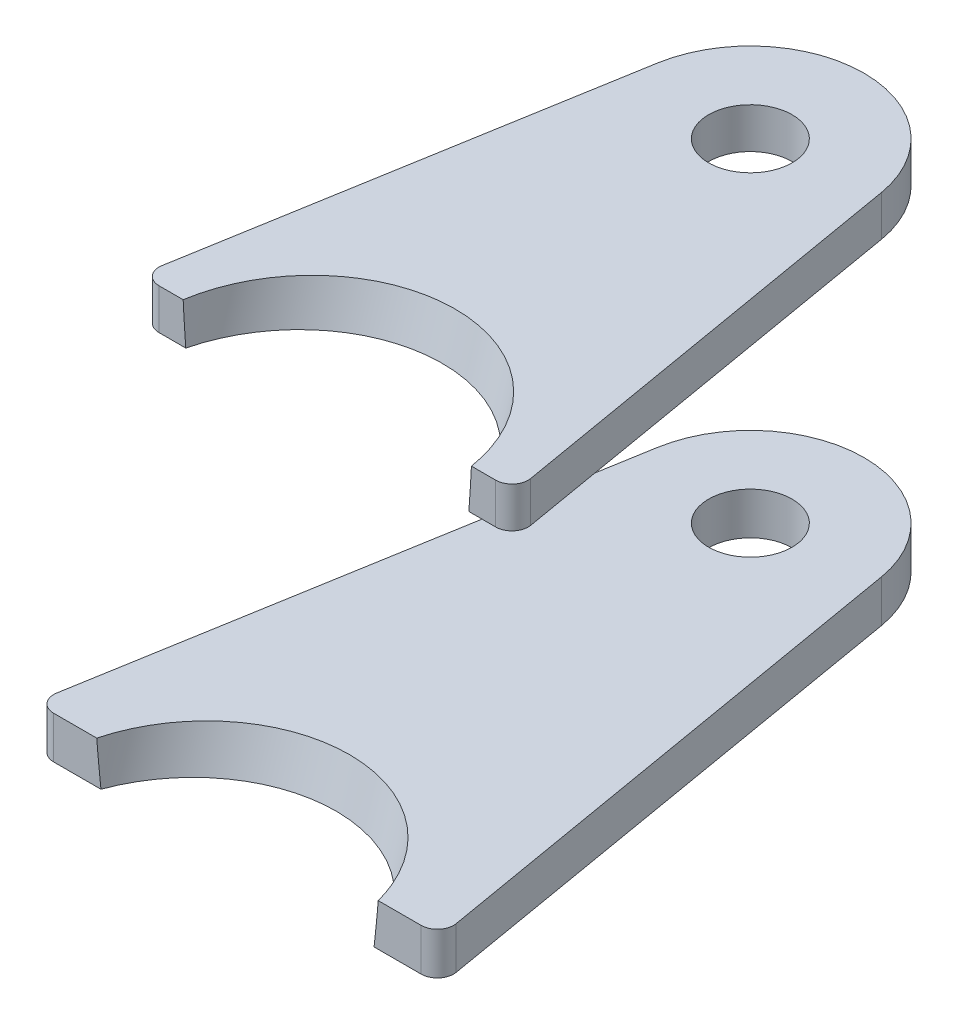
ISO-10303-21;
HEADER;
FILE_DESCRIPTION(('STEP AP214'),'2;1');
FILE_NAME('part.step','',(''),(''),'','','');
FILE_SCHEMA(('AUTOMOTIVE_DESIGN { 1 0 10303 214 1 1 1 1 }'));
ENDSEC;
DATA;
#1=APPLICATION_CONTEXT('core data for automotive mechanical design processes');
#2=APPLICATION_PROTOCOL_DEFINITION('international standard','automotive_design',2000,#1);
#3=PRODUCT_CONTEXT('',#1,'mechanical');
#4=PRODUCT('Part','Part','',(#3));
#5=PRODUCT_RELATED_PRODUCT_CATEGORY('part','',(#4));
#6=PRODUCT_DEFINITION_FORMATION('','',#4);
#7=PRODUCT_DEFINITION_CONTEXT('part definition',#1,'design');
#8=PRODUCT_DEFINITION('design','',#6,#7);
#9=PRODUCT_DEFINITION_SHAPE('','',#8);
#10=(LENGTH_UNIT() NAMED_UNIT(*) SI_UNIT(.MILLI.,.METRE.));
#11=(NAMED_UNIT(*) PLANE_ANGLE_UNIT() SI_UNIT($,.RADIAN.));
#12=(NAMED_UNIT(*) SI_UNIT($,.STERADIAN.) SOLID_ANGLE_UNIT());
#13=UNCERTAINTY_MEASURE_WITH_UNIT(LENGTH_MEASURE(1.E-05),#10,'distance_accuracy_value','');
#14=(GEOMETRIC_REPRESENTATION_CONTEXT(3) GLOBAL_UNCERTAINTY_ASSIGNED_CONTEXT((#13)) GLOBAL_UNIT_ASSIGNED_CONTEXT((#10,
#11,#12)) REPRESENTATION_CONTEXT('',''));
#15=CARTESIAN_POINT('',(0.,0.,0.));
#16=DIRECTION('',(0.,0.,1.));
#17=DIRECTION('',(1.,0.,0.));
#18=AXIS2_PLACEMENT_3D('',#15,#16,#17);
#19=CARTESIAN_POINT('',(0.,-11.43,0.));
#20=DIRECTION('',(0.,1.,0.));
#21=DIRECTION('',(0.,0.,-1.));
#22=AXIS2_PLACEMENT_3D('',#19,#20,#21);
#23=PLANE('',#22);
#24=DIRECTION('',(-1.,0.,0.));
#25=VECTOR('',#24,1.);
#26=CARTESIAN_POINT('',(0.,-11.43,40.1184711091296));
#27=LINE('',#26,#25);
#28=CARTESIAN_POINT('',(-11.0027053740969,-11.43,40.1184711091296));
#29=VERTEX_POINT('',#28);
#30=CARTESIAN_POINT('',(-14.3695490254812,-11.43,40.1184711091296));
#31=VERTEX_POINT('',#30);
#32=EDGE_CURVE('E127',#29,#31,#27,.T.);
#33=ORIENTED_EDGE('',*,*,#32,.F.);
#34=CARTESIAN_POINT('',(0.00635000098012531,-11.43,43.3453711793951));
#35=DIRECTION('',(0.,-1.,0.));
#36=DIRECTION('',(0.00174746557868569,0.,0.99999847318086));
#37=AXIS2_PLACEMENT_3D('',#34,#35,#36);
#38=ELLIPSE('',#37,11.993733960152,11.43);
#39=CARTESIAN_POINT('',(11.0143701263817,-11.43,40.1184711091295));
#40=VERTEX_POINT('',#39);
#41=EDGE_CURVE('E134',#40,#29,#38,.F.);
#42=ORIENTED_EDGE('',*,*,#41,.F.);
#43=CARTESIAN_POINT('',(14.3695490254812,-11.43,40.1184711091295));
#44=VERTEX_POINT('',#43);
#45=EDGE_CURVE('E139',#44,#40,#27,.T.);
#46=ORIENTED_EDGE('',*,*,#45,.F.);
#47=CARTESIAN_POINT('',(14.3695490254812,-11.43,38.8484711091295));
#48=DIRECTION('',(0.,-1.,0.));
#49=DIRECTION('',(0.,0.,-1.));
#50=AXIS2_PLACEMENT_3D('',#47,#48,#49);
#51=CIRCLE('',#50,1.27);
#52=CARTESIAN_POINT('',(15.6214000011449,-11.43,38.6345338876608));
#53=VERTEX_POINT('',#52);
#54=EDGE_CURVE('E185',#53,#44,#51,.T.);
#55=ORIENTED_EDGE('',*,*,#54,.F.);
#56=DIRECTION('',(0.168454505093508,0.,0.985709429656479));
#57=VECTOR('',#56,1.);
#58=CARTESIAN_POINT('',(8.76295682964609,-11.43,-1.49756055028128));
#59=LINE('',#58,#57);
#60=CARTESIAN_POINT('',(8.76295682964609,-11.43,-1.49756055028128));
#61=VERTEX_POINT('',#60);
#62=EDGE_CURVE('E149',#61,#53,#59,.T.);
#63=ORIENTED_EDGE('',*,*,#62,.F.);
#64=CARTESIAN_POINT('',(0.,-11.43,0.));
#65=DIRECTION('',(0.,-1.,0.));
#66=DIRECTION('',(0.,0.,-1.));
#67=AXIS2_PLACEMENT_3D('',#64,#65,#66);
#68=CIRCLE('',#67,8.89);
#69=CARTESIAN_POINT('',(-8.76295682964609,-11.43,-1.49756055028128));
#70=VERTEX_POINT('',#69);
#71=EDGE_CURVE('E146',#70,#61,#68,.T.);
#72=ORIENTED_EDGE('',*,*,#71,.F.);
#73=DIRECTION('',(-0.168454505093508,0.,0.985709429656479));
#74=VECTOR('',#73,1.);
#75=CARTESIAN_POINT('',(-8.76295682964609,-11.43,-1.49756055028128));
#76=LINE('',#75,#74);
#77=CARTESIAN_POINT('',(-15.6214000011449,-11.43,38.6345338876608));
#78=VERTEX_POINT('',#77);
#79=EDGE_CURVE('E169',#70,#78,#76,.T.);
#80=ORIENTED_EDGE('',*,*,#79,.T.);
#81=CARTESIAN_POINT('',(-14.3695490254812,-11.43,38.8484711091296));
#82=DIRECTION('',(0.,-1.,0.));
#83=DIRECTION('',(0.,0.,-1.));
#84=AXIS2_PLACEMENT_3D('',#81,#82,#83);
#85=CIRCLE('',#84,1.27);
#86=EDGE_CURVE('E145',#31,#78,#85,.T.);
#87=ORIENTED_EDGE('',*,*,#86,.F.);
#88=EDGE_LOOP('',(#33,#42,#46,#55,#63,#72,#80,#87));
#89=FACE_BOUND('',#88,.T.);
#90=CARTESIAN_POINT('',(0.,-11.43,0.));
#91=DIRECTION('',(0.,-1.,0.));
#92=DIRECTION('',(0.,0.,-1.));
#93=AXIS2_PLACEMENT_3D('',#90,#91,#92);
#94=CIRCLE('',#93,3.2639);
#95=CARTESIAN_POINT('',(0.,-11.43,-3.2639));
#96=VERTEX_POINT('',#95);
#97=EDGE_CURVE('E163',#96,#96,#94,.T.);
#98=ORIENTED_EDGE('',*,*,#97,.T.);
#99=EDGE_LOOP('',(#98));
#100=FACE_BOUND('',#99,.T.);
#101=ADVANCED_FACE('F56',(#89,#100),#23,.T.);
#102=CARTESIAN_POINT('',(-14.3695490254812,-14.732,38.8484711091296));
#103=DIRECTION('',(0.,-1.,0.));
#104=DIRECTION('',(0.,0.,1.));
#105=AXIS2_PLACEMENT_3D('',#102,#103,#104);
#106=CYLINDRICAL_SURFACE('',#105,1.27);
#107=CARTESIAN_POINT('',(-14.3695490254812,-14.732,38.8484711091296));
#108=DIRECTION('',(0.,-1.,0.));
#109=DIRECTION('',(0.,0.,-1.));
#110=AXIS2_PLACEMENT_3D('',#107,#108,#109);
#111=CIRCLE('',#110,1.27);
#112=CARTESIAN_POINT('',(-15.6214000011449,-14.732,38.6345338876608));
#113=VERTEX_POINT('',#112);
#114=CARTESIAN_POINT('',(-14.3695490254812,-14.732,40.1184711091296));
#115=VERTEX_POINT('',#114);
#116=EDGE_CURVE('E183',#113,#115,#111,.F.);
#117=ORIENTED_EDGE('',*,*,#116,.T.);
#118=DIRECTION('',(0.,1.,0.));
#119=VECTOR('',#118,1.);
#120=CARTESIAN_POINT('',(-14.3695490254812,-11.43,40.1184711091296));
#121=LINE('',#120,#119);
#122=EDGE_CURVE('E176',#115,#31,#121,.T.);
#123=ORIENTED_EDGE('',*,*,#122,.T.);
#124=ORIENTED_EDGE('',*,*,#86,.T.);
#125=DIRECTION('',(0.,1.,0.));
#126=VECTOR('',#125,1.);
#127=CARTESIAN_POINT('',(-15.6214000011449,-14.732,38.6345338876608));
#128=LINE('',#127,#126);
#129=EDGE_CURVE('E188',#78,#113,#128,.F.);
#130=ORIENTED_EDGE('',*,*,#129,.T.);
#131=EDGE_LOOP('',(#117,#123,#124,#130));
#132=FACE_BOUND('',#131,.T.);
#133=ADVANCED_FACE('F187',(#132),#106,.T.);
#134=CARTESIAN_POINT('',(-8.76295682964609,-14.732,-1.49756055028128));
#135=DIRECTION('',(0.985709429656479,0.,0.168454505093508));
#136=DIRECTION('',(-0.168454505093508,0.,0.985709429656479));
#137=AXIS2_PLACEMENT_3D('',#134,#135,#136);
#138=PLANE('',#137);
#139=ORIENTED_EDGE('',*,*,#79,.F.);
#140=DIRECTION('',(0.,1.,0.));
#141=VECTOR('',#140,1.);
#142=CARTESIAN_POINT('',(-8.76295682964609,-14.732,-1.49756055028128));
#143=LINE('',#142,#141);
#144=CARTESIAN_POINT('',(-8.76295682964609,-14.732,-1.49756055028128));
#145=VERTEX_POINT('',#144);
#146=EDGE_CURVE('E130',#145,#70,#143,.T.);
#147=ORIENTED_EDGE('',*,*,#146,.F.);
#148=DIRECTION('',(-0.168454505093508,0.,0.985709429656479));
#149=VECTOR('',#148,1.);
#150=CARTESIAN_POINT('',(-8.76295682964609,-14.732,-1.49756055028128));
#151=LINE('',#150,#149);
#152=EDGE_CURVE('E155',#145,#113,#151,.T.);
#153=ORIENTED_EDGE('',*,*,#152,.T.);
#154=ORIENTED_EDGE('',*,*,#129,.F.);
#155=EDGE_LOOP('',(#139,#147,#153,#154));
#156=FACE_BOUND('',#155,.T.);
#157=ADVANCED_FACE('F207',(#156),#138,.F.);
#158=CARTESIAN_POINT('',(0.,-14.732,0.));
#159=DIRECTION('',(0.,1.,0.));
#160=DIRECTION('',(0.,0.,-1.));
#161=AXIS2_PLACEMENT_3D('',#158,#159,#160);
#162=CYLINDRICAL_SURFACE('',#161,8.89);
#163=ORIENTED_EDGE('',*,*,#146,.T.);
#164=ORIENTED_EDGE('',*,*,#71,.T.);
#165=DIRECTION('',(0.,1.,0.));
#166=VECTOR('',#165,1.);
#167=CARTESIAN_POINT('',(8.76295682964609,-14.732,-1.49756055028128));
#168=LINE('',#167,#166);
#169=CARTESIAN_POINT('',(8.76295682964609,-14.732,-1.49756055028128));
#170=VERTEX_POINT('',#169);
#171=EDGE_CURVE('E165',#170,#61,#168,.T.);
#172=ORIENTED_EDGE('',*,*,#171,.F.);
#173=CARTESIAN_POINT('',(0.,-14.732,0.));
#174=DIRECTION('',(0.,-1.,0.));
#175=DIRECTION('',(0.,0.,-1.));
#176=AXIS2_PLACEMENT_3D('',#173,#174,#175);
#177=CIRCLE('',#176,8.89);
#178=EDGE_CURVE('E167',#145,#170,#177,.T.);
#179=ORIENTED_EDGE('',*,*,#178,.F.);
#180=EDGE_LOOP('',(#163,#164,#172,#179));
#181=FACE_BOUND('',#180,.T.);
#182=ADVANCED_FACE('F203',(#181),#162,.T.);
#183=CARTESIAN_POINT('',(8.76295682964609,-14.732,-1.49756055028128));
#184=DIRECTION('',(0.985709429656479,0.,-0.168454505093508));
#185=DIRECTION('',(0.168454505093508,0.,0.985709429656479));
#186=AXIS2_PLACEMENT_3D('',#183,#184,#185);
#187=PLANE('',#186);
#188=DIRECTION('',(0.168454505093508,0.,0.985709429656479));
#189=VECTOR('',#188,1.);
#190=CARTESIAN_POINT('',(8.76295682964609,-14.732,-1.49756055028128));
#191=LINE('',#190,#189);
#192=CARTESIAN_POINT('',(15.6214000011449,-14.732,38.6345338876608));
#193=VERTEX_POINT('',#192);
#194=EDGE_CURVE('E159',#170,#193,#191,.T.);
#195=ORIENTED_EDGE('',*,*,#194,.F.);
#196=ORIENTED_EDGE('',*,*,#171,.T.);
#197=ORIENTED_EDGE('',*,*,#62,.T.);
#198=DIRECTION('',(0.,1.,0.));
#199=VECTOR('',#198,1.);
#200=CARTESIAN_POINT('',(15.6214000011449,-14.732,38.6345338876608));
#201=LINE('',#200,#199);
#202=EDGE_CURVE('E64',#193,#53,#201,.T.);
#203=ORIENTED_EDGE('',*,*,#202,.F.);
#204=EDGE_LOOP('',(#195,#196,#197,#203));
#205=FACE_BOUND('',#204,.T.);
#206=ADVANCED_FACE('F199',(#205),#187,.T.);
#207=CARTESIAN_POINT('',(14.3695490254812,-14.732,38.8484711091295));
#208=DIRECTION('',(0.,1.,0.));
#209=DIRECTION('',(0.,0.,-1.));
#210=AXIS2_PLACEMENT_3D('',#207,#208,#209);
#211=CYLINDRICAL_SURFACE('',#210,1.27);
#212=CARTESIAN_POINT('',(14.3695490254812,-14.732,38.8484711091295));
#213=DIRECTION('',(0.,-1.,0.));
#214=DIRECTION('',(0.,0.,-1.));
#215=AXIS2_PLACEMENT_3D('',#212,#213,#214);
#216=CIRCLE('',#215,1.27);
#217=CARTESIAN_POINT('',(14.3695490254812,-14.732,40.1184711091295));
#218=VERTEX_POINT('',#217);
#219=EDGE_CURVE('E70',#218,#193,#216,.F.);
#220=ORIENTED_EDGE('',*,*,#219,.T.);
#221=ORIENTED_EDGE('',*,*,#202,.T.);
#222=ORIENTED_EDGE('',*,*,#54,.T.);
#223=DIRECTION('',(0.,1.,0.));
#224=VECTOR('',#223,1.);
#225=CARTESIAN_POINT('',(14.3695490254812,-14.732,40.1184711091295));
#226=LINE('',#225,#224);
#227=EDGE_CURVE('E12',#44,#218,#226,.F.);
#228=ORIENTED_EDGE('',*,*,#227,.T.);
#229=EDGE_LOOP('',(#220,#221,#222,#228));
#230=FACE_BOUND('',#229,.T.);
#231=ADVANCED_FACE('F58',(#230),#211,.T.);
#232=CARTESIAN_POINT('',(0.,-14.732,40.1184711091296));
#233=DIRECTION('',(0.,0.,1.));
#234=DIRECTION('',(-1.,0.,0.));
#235=AXIS2_PLACEMENT_3D('',#232,#233,#234);
#236=PLANE('',#235);
#237=ORIENTED_EDGE('',*,*,#45,.T.);
#238=CARTESIAN_POINT('',(0.000711095571889094,-1.27997183153469,40.1184711091296));
#239=DIRECTION('',(0.,0.,-1.));
#240=DIRECTION('',(0.00055555555555526,-0.999999845679001,0.));
#241=AXIS2_PLACEMENT_3D('',#238,#239,#240);
#242=ELLIPSE('',#241,37.7255988378355,11.43);
#243=CARTESIAN_POINT('',(10.686165471172,-14.732,40.1184711091295));
#244=VERTEX_POINT('',#243);
#245=EDGE_CURVE('E132',#244,#40,#242,.F.);
#246=ORIENTED_EDGE('',*,*,#245,.F.);
#247=DIRECTION('',(-1.,0.,0.));
#248=VECTOR('',#247,1.);
#249=CARTESIAN_POINT('',(0.,-14.732,40.1184711091296));
#250=LINE('',#249,#248);
#251=EDGE_CURVE('E78',#218,#244,#250,.T.);
#252=ORIENTED_EDGE('',*,*,#251,.F.);
#253=ORIENTED_EDGE('',*,*,#227,.F.);
#254=EDGE_LOOP('',(#237,#246,#252,#253));
#255=FACE_BOUND('',#254,.T.);
#256=ADVANCED_FACE('F226',(#255),#236,.T.);
#257=CARTESIAN_POINT('',(-10.6711686161259,-14.732,40.1184711091296));
#258=VERTEX_POINT('',#257);
#259=EDGE_CURVE('E128',#258,#115,#250,.T.);
#260=ORIENTED_EDGE('',*,*,#259,.F.);
#261=EDGE_CURVE('E122',#29,#258,#242,.F.);
#262=ORIENTED_EDGE('',*,*,#261,.F.);
#263=ORIENTED_EDGE('',*,*,#32,.T.);
#264=ORIENTED_EDGE('',*,*,#122,.F.);
#265=EDGE_LOOP('',(#260,#262,#263,#264));
#266=FACE_BOUND('',#265,.T.);
#267=ADVANCED_FACE('F124',(#266),#236,.T.);
#268=CARTESIAN_POINT('',(0.,-14.732,0.));
#269=DIRECTION('',(0.,1.,0.));
#270=DIRECTION('',(0.,0.,-1.));
#271=AXIS2_PLACEMENT_3D('',#268,#269,#270);
#272=PLANE('',#271);
#273=ORIENTED_EDGE('',*,*,#152,.F.);
#274=ORIENTED_EDGE('',*,*,#178,.T.);
#275=ORIENTED_EDGE('',*,*,#194,.T.);
#276=ORIENTED_EDGE('',*,*,#219,.F.);
#277=ORIENTED_EDGE('',*,*,#251,.T.);
#278=CARTESIAN_POINT('',(0.00818444570766258,-14.732,44.3951440327475));
#279=DIRECTION('',(0.,-1.,0.));
#280=DIRECTION('',(0.00174746557868569,0.,0.99999847318086));
#281=AXIS2_PLACEMENT_3D('',#278,#279,#280);
#282=ELLIPSE('',#281,11.993733960152,11.43);
#283=EDGE_CURVE('E175',#244,#258,#282,.F.);
#284=ORIENTED_EDGE('',*,*,#283,.T.);
#285=ORIENTED_EDGE('',*,*,#259,.T.);
#286=ORIENTED_EDGE('',*,*,#116,.F.);
#287=EDGE_LOOP('',(#273,#274,#275,#276,#277,#284,#285,#286));
#288=FACE_BOUND('',#287,.T.);
#289=CARTESIAN_POINT('',(0.,-14.732,0.));
#290=DIRECTION('',(0.,-1.,0.));
#291=DIRECTION('',(0.,0.,-1.));
#292=AXIS2_PLACEMENT_3D('',#289,#290,#291);
#293=CIRCLE('',#292,3.2639);
#294=CARTESIAN_POINT('',(0.,-14.732,-3.2639));
#295=VERTEX_POINT('',#294);
#296=EDGE_CURVE('E153',#295,#295,#293,.T.);
#297=ORIENTED_EDGE('',*,*,#296,.F.);
#298=EDGE_LOOP('',(#297));
#299=FACE_BOUND('',#298,.T.);
#300=ADVANCED_FACE('F180',(#288,#299),#272,.F.);
#301=CARTESIAN_POINT('',(0.,-14.732,0.));
#302=DIRECTION('',(0.,1.,0.));
#303=DIRECTION('',(0.,0.,-1.));
#304=AXIS2_PLACEMENT_3D('',#301,#302,#303);
#305=CYLINDRICAL_SURFACE('',#304,3.2639);
#306=CARTESIAN_POINT('',(0.,-14.732,-3.2639));
#307=CARTESIAN_POINT('',(0.,-14.6976041666667,-3.2639));
#308=CARTESIAN_POINT('',(0.,-14.6632083333333,-3.2639));
#309=CARTESIAN_POINT('',(0.,-14.5944166666667,-3.2639));
#310=CARTESIAN_POINT('',(0.,-14.5600208333333,-3.2639));
#311=CARTESIAN_POINT('',(0.,-14.4912291666667,-3.2639));
#312=CARTESIAN_POINT('',(0.,-14.4568333333333,-3.2639));
#313=CARTESIAN_POINT('',(0.,-14.3880416666667,-3.2639));
#314=CARTESIAN_POINT('',(0.,-14.3536458333333,-3.2639));
#315=CARTESIAN_POINT('',(0.,-14.2848541666667,-3.2639));
#316=CARTESIAN_POINT('',(0.,-14.2504583333333,-3.2639));
#317=CARTESIAN_POINT('',(0.,-14.1816666666667,-3.2639));
#318=CARTESIAN_POINT('',(0.,-14.1472708333333,-3.2639));
#319=CARTESIAN_POINT('',(0.,-14.0784791666667,-3.2639));
#320=CARTESIAN_POINT('',(0.,-14.0440833333333,-3.2639));
#321=CARTESIAN_POINT('',(0.,-13.9752916666667,-3.2639));
#322=CARTESIAN_POINT('',(0.,-13.9408958333333,-3.2639));
#323=CARTESIAN_POINT('',(0.,-13.8721041666667,-3.2639));
#324=CARTESIAN_POINT('',(0.,-13.8377083333333,-3.2639));
#325=CARTESIAN_POINT('',(0.,-13.7689166666667,-3.2639));
#326=CARTESIAN_POINT('',(0.,-13.7345208333333,-3.2639));
#327=CARTESIAN_POINT('',(0.,-13.6657291666667,-3.2639));
#328=CARTESIAN_POINT('',(0.,-13.6313333333333,-3.2639));
#329=CARTESIAN_POINT('',(0.,-13.5625416666667,-3.2639));
#330=CARTESIAN_POINT('',(0.,-13.5281458333333,-3.2639));
#331=CARTESIAN_POINT('',(0.,-13.4593541666667,-3.2639));
#332=CARTESIAN_POINT('',(0.,-13.4249583333333,-3.2639));
#333=CARTESIAN_POINT('',(0.,-13.3561666666667,-3.2639));
#334=CARTESIAN_POINT('',(0.,-13.3217708333333,-3.2639));
#335=CARTESIAN_POINT('',(0.,-13.2529791666667,-3.2639));
#336=CARTESIAN_POINT('',(0.,-13.2185833333333,-3.2639));
#337=CARTESIAN_POINT('',(0.,-13.1497916666667,-3.2639));
#338=CARTESIAN_POINT('',(0.,-13.1153958333333,-3.2639));
#339=CARTESIAN_POINT('',(0.,-13.0466041666667,-3.2639));
#340=CARTESIAN_POINT('',(0.,-13.0122083333333,-3.2639));
#341=CARTESIAN_POINT('',(0.,-12.9434166666667,-3.2639));
#342=CARTESIAN_POINT('',(0.,-12.9090208333333,-3.2639));
#343=CARTESIAN_POINT('',(0.,-12.8402291666667,-3.2639));
#344=CARTESIAN_POINT('',(0.,-12.8058333333333,-3.2639));
#345=CARTESIAN_POINT('',(0.,-12.7370416666667,-3.2639));
#346=CARTESIAN_POINT('',(0.,-12.7026458333333,-3.2639));
#347=CARTESIAN_POINT('',(0.,-12.6338541666667,-3.2639));
#348=CARTESIAN_POINT('',(0.,-12.5994583333333,-3.2639));
#349=CARTESIAN_POINT('',(0.,-12.5306666666667,-3.2639));
#350=CARTESIAN_POINT('',(0.,-12.4962708333333,-3.2639));
#351=CARTESIAN_POINT('',(0.,-12.4274791666667,-3.2639));
#352=CARTESIAN_POINT('',(0.,-12.3930833333333,-3.2639));
#353=CARTESIAN_POINT('',(0.,-12.3242916666667,-3.2639));
#354=CARTESIAN_POINT('',(0.,-12.2898958333333,-3.2639));
#355=CARTESIAN_POINT('',(0.,-12.2211041666667,-3.2639));
#356=CARTESIAN_POINT('',(0.,-12.1867083333333,-3.2639));
#357=CARTESIAN_POINT('',(0.,-12.1179166666667,-3.2639));
#358=CARTESIAN_POINT('',(0.,-12.0835208333333,-3.2639));
#359=CARTESIAN_POINT('',(0.,-12.0147291666667,-3.2639));
#360=CARTESIAN_POINT('',(0.,-11.9803333333333,-3.2639));
#361=CARTESIAN_POINT('',(0.,-11.9115416666667,-3.2639));
#362=CARTESIAN_POINT('',(0.,-11.8771458333333,-3.2639));
#363=CARTESIAN_POINT('',(0.,-11.8083541666667,-3.2639));
#364=CARTESIAN_POINT('',(0.,-11.7739583333333,-3.2639));
#365=CARTESIAN_POINT('',(0.,-11.7051666666667,-3.2639));
#366=CARTESIAN_POINT('',(0.,-11.6707708333333,-3.2639));
#367=CARTESIAN_POINT('',(0.,-11.6019791666667,-3.2639));
#368=CARTESIAN_POINT('',(0.,-11.5675833333333,-3.2639));
#369=CARTESIAN_POINT('',(0.,-11.4987916666667,-3.2639));
#370=CARTESIAN_POINT('',(0.,-11.4643958333333,-3.2639));
#371=CARTESIAN_POINT('',(0.,-11.43,-3.2639));
#372=B_SPLINE_CURVE_WITH_KNOTS('',3,(#306,#307,#308,#309,#310,#311,#312,#313,#314,#315,#316,
#317,#318,#319,#320,#321,#322,#323,#324,#325,#326,#327,#328,#329,#330,#331,#332,#333,#334,#335,
#336,#337,#338,#339,#340,#341,#342,#343,#344,#345,#346,#347,#348,#349,#350,#351,#352,#353,#354,
#355,#356,#357,#358,#359,#360,#361,#362,#363,#364,#365,#366,#367,#368,#369,#370,#371),
.UNSPECIFIED.,.F.,.F.,(4,2,2,2,2,2,2,2,2,2,2,2,2,2,2,2,2,2,2,2,2,2,2,2,2,2,2,2,2,2,2,2,4),(0.,
0.103187499999999,0.206375,0.309562499999999,0.41275,0.515937499999999,0.619125,
0.722312499999999,0.8255,0.928687499999999,1.031875,1.1350625,1.23825,1.3414375,1.444625,
1.5478125,1.651,1.7541875,1.857375,1.9605625,2.06375,2.1669375,2.270125,2.3733125,2.4765,
2.5796875,2.682875,2.7860625,2.88925,2.9924375,3.095625,3.1988125,3.302),.UNSPECIFIED.);
#373=EDGE_CURVE('BSEAM224',#295,#96,#372,.T.);
#374=ORIENTED_EDGE('',*,*,#296,.T.);
#375=ORIENTED_EDGE('',*,*,#97,.F.);
#376=ORIENTED_EDGE('',*,*,#373,.T.);
#377=ORIENTED_EDGE('',*,*,#373,.F.);
#378=EDGE_LOOP('',(#374,#376,#375,#377));
#379=FACE_BOUND('',#378,.T.);
#380=ADVANCED_FACE('F224',(#379),#305,.F.);
#381=CARTESIAN_POINT('',(-0.0609017951073154,109.623214276372,4.86009614657135));
#382=DIRECTION('',(0.000529443207681107,-0.952997626758693,0.302977297965028));
#383=DIRECTION('',(-0.000168320721091388,0.302977251209269,0.952997773826262));
#384=AXIS2_PLACEMENT_3D('',#381,#382,#383);
#385=CYLINDRICAL_SURFACE('',#384,11.43);
#386=ORIENTED_EDGE('',*,*,#283,.F.);
#387=ORIENTED_EDGE('',*,*,#245,.T.);
#388=ORIENTED_EDGE('',*,*,#41,.T.);
#389=ORIENTED_EDGE('',*,*,#261,.T.);
#390=EDGE_LOOP('',(#386,#387,#388,#389));
#391=FACE_BOUND('',#390,.T.);
#392=ADVANCED_FACE('F135',(#391),#385,.F.);
#393=CLOSED_SHELL('',(#101,#133,#157,#182,#206,#231,#256,#267,#300,#380,#392));
#394=MANIFOLD_SOLID_BREP('B2',#393);
#395=CARTESIAN_POINT('',(-8.76295682964609,14.605,-1.49756055028128));
#396=DIRECTION('',(-0.985709429656479,0.,-0.168454505093508));
#397=DIRECTION('',(0.168454505093508,0.,-0.985709429656479));
#398=AXIS2_PLACEMENT_3D('',#395,#396,#397);
#399=PLANE('',#398);
#400=DIRECTION('',(-0.168454505093508,0.,0.985709429656479));
#401=VECTOR('',#400,1.);
#402=CARTESIAN_POINT('',(-8.76295682964609,14.605,-1.49756055028128));
#403=LINE('',#402,#401);
#404=CARTESIAN_POINT('',(-8.7629568296461,14.605,-1.49756055028128));
#405=VERTEX_POINT('',#404);
#406=CARTESIAN_POINT('',(-14.418582270087,14.605,31.5962609782862));
#407=VERTEX_POINT('',#406);
#408=EDGE_CURVE('E404',#405,#407,#403,.T.);
#409=ORIENTED_EDGE('',*,*,#408,.F.);
#410=DIRECTION('',(0.,-1.,0.));
#411=VECTOR('',#410,1.);
#412=CARTESIAN_POINT('',(-8.7629568296461,14.605,-1.49756055028128));
#413=LINE('',#412,#411);
#414=CARTESIAN_POINT('',(-8.7629568296461,11.43,-1.49756055028128));
#415=VERTEX_POINT('',#414);
#416=EDGE_CURVE('E418',#405,#415,#413,.T.);
#417=ORIENTED_EDGE('',*,*,#416,.T.);
#418=DIRECTION('',(-0.168454505093508,0.,0.985709429656479));
#419=VECTOR('',#418,1.);
#420=CARTESIAN_POINT('',(-8.76295682964609,11.43,-1.49756055028128));
#421=LINE('',#420,#419);
#422=CARTESIAN_POINT('',(-14.418582270087,11.43,31.5962609782862));
#423=VERTEX_POINT('',#422);
#424=EDGE_CURVE('E413',#415,#423,#421,.T.);
#425=ORIENTED_EDGE('',*,*,#424,.T.);
#426=DIRECTION('',(0.,1.,0.));
#427=VECTOR('',#426,1.);
#428=CARTESIAN_POINT('',(-14.418582270087,14.605,31.5962609782862));
#429=LINE('',#428,#427);
#430=EDGE_CURVE('E54',#407,#423,#429,.F.);
#431=ORIENTED_EDGE('',*,*,#430,.F.);
#432=EDGE_LOOP('',(#409,#417,#425,#431));
#433=FACE_BOUND('',#432,.T.);
#434=ADVANCED_FACE('F324',(#433),#399,.T.);
#435=CARTESIAN_POINT('',(8.76295682964609,14.605,-1.49756055028128));
#436=DIRECTION('',(-0.985709429656479,0.,0.168454505093508));
#437=DIRECTION('',(-0.168454505093508,0.,-0.985709429656479));
#438=AXIS2_PLACEMENT_3D('',#435,#436,#437);
#439=PLANE('',#438);
#440=DIRECTION('',(0.168454505093508,0.,0.985709429656479));
#441=VECTOR('',#440,1.);
#442=CARTESIAN_POINT('',(8.76295682964609,11.43,-1.49756055028128));
#443=LINE('',#442,#441);
#444=CARTESIAN_POINT('',(8.7629568296461,11.43,-1.49756055028128));
#445=VERTEX_POINT('',#444);
#446=CARTESIAN_POINT('',(14.418582270087,11.43,31.5962609782862));
#447=VERTEX_POINT('',#446);
#448=EDGE_CURVE('E421',#445,#447,#443,.T.);
#449=ORIENTED_EDGE('',*,*,#448,.F.);
#450=DIRECTION('',(0.,-1.,0.));
#451=VECTOR('',#450,1.);
#452=CARTESIAN_POINT('',(8.7629568296461,14.605,-1.49756055028128));
#453=LINE('',#452,#451);
#454=CARTESIAN_POINT('',(8.7629568296461,14.605,-1.49756055028128));
#455=VERTEX_POINT('',#454);
#456=EDGE_CURVE('E423',#455,#445,#453,.T.);
#457=ORIENTED_EDGE('',*,*,#456,.F.);
#458=DIRECTION('',(0.168454505093508,0.,0.985709429656479));
#459=VECTOR('',#458,1.);
#460=CARTESIAN_POINT('',(8.76295682964609,14.605,-1.49756055028128));
#461=LINE('',#460,#459);
#462=CARTESIAN_POINT('',(14.418582270087,14.605,31.5962609782862));
#463=VERTEX_POINT('',#462);
#464=EDGE_CURVE('E432',#455,#463,#461,.T.);
#465=ORIENTED_EDGE('',*,*,#464,.T.);
#466=DIRECTION('',(0.,1.,0.));
#467=VECTOR('',#466,1.);
#468=CARTESIAN_POINT('',(14.418582270087,14.605,31.5962609782862));
#469=LINE('',#468,#467);
#470=EDGE_CURVE('E399',#447,#463,#469,.T.);
#471=ORIENTED_EDGE('',*,*,#470,.F.);
#472=EDGE_LOOP('',(#449,#457,#465,#471));
#473=FACE_BOUND('',#472,.T.);
#474=ADVANCED_FACE('F468',(#473),#439,.F.);
#475=CARTESIAN_POINT('',(0.,11.43,0.));
#476=DIRECTION('',(0.,1.,0.));
#477=DIRECTION('',(0.,0.,-1.));
#478=AXIS2_PLACEMENT_3D('',#475,#476,#477);
#479=PLANE('',#478);
#480=CARTESIAN_POINT('',(0.,11.43,0.));
#481=DIRECTION('',(0.,-1.,0.));
#482=DIRECTION('',(0.,0.,-1.));
#483=AXIS2_PLACEMENT_3D('',#480,#481,#482);
#484=CIRCLE('',#483,3.2639);
#485=CARTESIAN_POINT('',(0.,11.43,-3.2639));
#486=VERTEX_POINT('',#485);
#487=EDGE_CURVE('E410',#486,#486,#484,.T.);
#488=ORIENTED_EDGE('',*,*,#487,.F.);
#489=EDGE_LOOP('',(#488));
#490=FACE_BOUND('',#489,.T.);
#491=DIRECTION('',(1.,0.,0.));
#492=VECTOR('',#491,1.);
#493=CARTESIAN_POINT('',(0.,11.43,33.080198199755));
#494=LINE('',#493,#492);
#495=CARTESIAN_POINT('',(11.0604465567523,11.43,33.080198199755));
#496=VERTEX_POINT('',#495);
#497=CARTESIAN_POINT('',(13.1667312944233,11.43,33.080198199755));
#498=VERTEX_POINT('',#497);
#499=EDGE_CURVE('E405',#496,#498,#494,.T.);
#500=ORIENTED_EDGE('',*,*,#499,.F.);
#501=CARTESIAN_POINT('',(-0.0063500009797481,11.43,36.0777129638786));
#502=DIRECTION('',(0.,-1.,0.));
#503=DIRECTION('',(0.00174746557868569,0.,0.99999847318086));
#504=AXIS2_PLACEMENT_3D('',#501,#502,#503);
#505=ELLIPSE('',#504,11.993733960152,11.43);
#506=CARTESIAN_POINT('',(-11.0741082173065,11.43,33.080198199755));
#507=VERTEX_POINT('',#506);
#508=EDGE_CURVE('E395',#496,#507,#505,.F.);
#509=ORIENTED_EDGE('',*,*,#508,.T.);
#510=CARTESIAN_POINT('',(-13.1667312944233,11.43,33.080198199755));
#511=VERTEX_POINT('',#510);
#512=EDGE_CURVE('E402',#511,#507,#494,.T.);
#513=ORIENTED_EDGE('',*,*,#512,.F.);
#514=CARTESIAN_POINT('',(-13.1667312944233,11.43,31.810198199755));
#515=DIRECTION('',(0.,-1.,0.));
#516=DIRECTION('',(0.,0.,-1.));
#517=AXIS2_PLACEMENT_3D('',#514,#515,#516);
#518=CIRCLE('',#517,1.27);
#519=EDGE_CURVE('E345',#423,#511,#518,.F.);
#520=ORIENTED_EDGE('',*,*,#519,.F.);
#521=ORIENTED_EDGE('',*,*,#424,.F.);
#522=CARTESIAN_POINT('',(0.,11.43,0.));
#523=DIRECTION('',(0.,-1.,0.));
#524=DIRECTION('',(0.,0.,-1.));
#525=AXIS2_PLACEMENT_3D('',#522,#523,#524);
#526=CIRCLE('',#525,8.89);
#527=EDGE_CURVE('E422',#415,#445,#526,.T.);
#528=ORIENTED_EDGE('',*,*,#527,.T.);
#529=ORIENTED_EDGE('',*,*,#448,.T.);
#530=CARTESIAN_POINT('',(13.1667312944233,11.43,31.810198199755));
#531=DIRECTION('',(0.,-1.,0.));
#532=DIRECTION('',(0.,0.,-1.));
#533=AXIS2_PLACEMENT_3D('',#530,#531,#532);
#534=CIRCLE('',#533,1.27);
#535=EDGE_CURVE('E451',#498,#447,#534,.F.);
#536=ORIENTED_EDGE('',*,*,#535,.F.);
#537=EDGE_LOOP('',(#500,#509,#513,#520,#521,#528,#529,#536));
#538=FACE_BOUND('',#537,.T.);
#539=ADVANCED_FACE('F407',(#490,#538),#479,.F.);
#540=CARTESIAN_POINT('',(-0.0609017951073154,109.623214276372,4.86009614657135));
#541=DIRECTION('',(0.000529443207681107,-0.952997626758693,0.302977297965028));
#542=DIRECTION('',(-0.000168320721091388,0.302977251209269,0.952997773826262));
#543=AXIS2_PLACEMENT_3D('',#540,#541,#542);
#544=CYLINDRICAL_SURFACE('',#543,11.43);
#545=ORIENTED_EDGE('',*,*,#508,.F.);
#546=CARTESIAN_POINT('',(-0.0115880628492294,20.8585099100517,33.080198199755));
#547=DIRECTION('',(0.,0.,-1.));
#548=DIRECTION('',(0.000555555555555474,-0.999999845679001,0.));
#549=AXIS2_PLACEMENT_3D('',#546,#547,#548);
#550=ELLIPSE('',#549,37.7255988378355,11.43);
#551=CARTESIAN_POINT('',(11.2634416811836,14.605,33.080198199755));
#552=VERTEX_POINT('',#551);
#553=EDGE_CURVE('E400',#552,#496,#550,.T.);
#554=ORIENTED_EDGE('',*,*,#553,.F.);
#555=CARTESIAN_POINT('',(-0.00811389014084163,14.605,35.0683159895013));
#556=DIRECTION('',(0.,-1.,0.));
#557=DIRECTION('',(0.00174746557868569,0.,0.99999847318086));
#558=AXIS2_PLACEMENT_3D('',#555,#556,#557);
#559=ELLIPSE('',#558,11.993733960152,11.43);
#560=CARTESIAN_POINT('',(-11.2803072867006,14.605,33.080198199755));
#561=VERTEX_POINT('',#560);
#562=EDGE_CURVE('E398',#552,#561,#559,.F.);
#563=ORIENTED_EDGE('',*,*,#562,.T.);
#564=EDGE_CURVE('E391',#507,#561,#550,.T.);
#565=ORIENTED_EDGE('',*,*,#564,.F.);
#566=EDGE_LOOP('',(#545,#554,#563,#565));
#567=FACE_BOUND('',#566,.T.);
#568=ADVANCED_FACE('F392',(#567),#544,.F.);
#569=CARTESIAN_POINT('',(0.,14.605,0.));
#570=DIRECTION('',(0.,-1.,0.));
#571=DIRECTION('',(0.,0.,1.));
#572=AXIS2_PLACEMENT_3D('',#569,#570,#571);
#573=CYLINDRICAL_SURFACE('',#572,8.89);
#574=ORIENTED_EDGE('',*,*,#527,.F.);
#575=ORIENTED_EDGE('',*,*,#416,.F.);
#576=CARTESIAN_POINT('',(0.,14.605,0.));
#577=DIRECTION('',(0.,-1.,0.));
#578=DIRECTION('',(0.,0.,-1.));
#579=AXIS2_PLACEMENT_3D('',#576,#577,#578);
#580=CIRCLE('',#579,8.89);
#581=EDGE_CURVE('E437',#405,#455,#580,.T.);
#582=ORIENTED_EDGE('',*,*,#581,.T.);
#583=ORIENTED_EDGE('',*,*,#456,.T.);
#584=EDGE_LOOP('',(#574,#575,#582,#583));
#585=FACE_BOUND('',#584,.T.);
#586=ADVANCED_FACE('F470',(#585),#573,.T.);
#587=CARTESIAN_POINT('',(0.,14.605,0.));
#588=DIRECTION('',(0.,-1.,0.));
#589=DIRECTION('',(0.,0.,1.));
#590=AXIS2_PLACEMENT_3D('',#587,#588,#589);
#591=CYLINDRICAL_SURFACE('',#590,3.2639);
#592=CARTESIAN_POINT('',(0.,14.605,0.));
#593=DIRECTION('',(0.,-1.,0.));
#594=DIRECTION('',(0.,0.,-1.));
#595=AXIS2_PLACEMENT_3D('',#592,#593,#594);
#596=CIRCLE('',#595,3.2639);
#597=CARTESIAN_POINT('',(0.,14.605,-3.2639));
#598=VERTEX_POINT('',#597);
#599=EDGE_CURVE('E425',#598,#598,#596,.T.);
#600=ORIENTED_EDGE('',*,*,#599,.F.);
#601=EDGE_LOOP('',(#600));
#602=FACE_BOUND('',#601,.T.);
#603=ORIENTED_EDGE('',*,*,#487,.T.);
#604=EDGE_LOOP('',(#603));
#605=FACE_BOUND('',#604,.T.);
#606=ADVANCED_FACE('F483',(#602,#605),#591,.F.);
#607=CARTESIAN_POINT('',(0.,-21.0907593015114,33.080198199755));
#608=DIRECTION('',(0.,0.,1.));
#609=DIRECTION('',(-1.,0.,0.));
#610=AXIS2_PLACEMENT_3D('',#607,#608,#609);
#611=PLANE('',#610);
#612=DIRECTION('',(-1.,0.,0.));
#613=VECTOR('',#612,1.);
#614=CARTESIAN_POINT('',(0.,14.605,33.080198199755));
#615=LINE('',#614,#613);
#616=CARTESIAN_POINT('',(13.1667312944233,14.605,33.080198199755));
#617=VERTEX_POINT('',#616);
#618=EDGE_CURVE('E417',#617,#552,#615,.T.);
#619=ORIENTED_EDGE('',*,*,#618,.T.);
#620=ORIENTED_EDGE('',*,*,#553,.T.);
#621=ORIENTED_EDGE('',*,*,#499,.T.);
#622=DIRECTION('',(0.,1.,0.));
#623=VECTOR('',#622,1.);
#624=CARTESIAN_POINT('',(13.1667312944233,11.43,33.080198199755));
#625=LINE('',#624,#623);
#626=EDGE_CURVE('E448',#617,#498,#625,.F.);
#627=ORIENTED_EDGE('',*,*,#626,.F.);
#628=EDGE_LOOP('',(#619,#620,#621,#627));
#629=FACE_BOUND('',#628,.T.);
#630=ADVANCED_FACE('F459',(#629),#611,.T.);
#631=ORIENTED_EDGE('',*,*,#512,.T.);
#632=ORIENTED_EDGE('',*,*,#564,.T.);
#633=CARTESIAN_POINT('',(-13.1667312944233,14.605,33.080198199755));
#634=VERTEX_POINT('',#633);
#635=EDGE_CURVE('E454',#561,#634,#615,.T.);
#636=ORIENTED_EDGE('',*,*,#635,.T.);
#637=DIRECTION('',(0.,1.,0.));
#638=VECTOR('',#637,1.);
#639=CARTESIAN_POINT('',(-13.1667312944233,-21.0907593015114,33.080198199755));
#640=LINE('',#639,#638);
#641=EDGE_CURVE('E332',#511,#634,#640,.T.);
#642=ORIENTED_EDGE('',*,*,#641,.F.);
#643=EDGE_LOOP('',(#631,#632,#636,#642));
#644=FACE_BOUND('',#643,.T.);
#645=ADVANCED_FACE('F403',(#644),#611,.T.);
#646=CARTESIAN_POINT('',(13.1667312944233,14.605,31.810198199755));
#647=DIRECTION('',(0.,-1.,0.));
#648=DIRECTION('',(0.,0.,1.));
#649=AXIS2_PLACEMENT_3D('',#646,#647,#648);
#650=CYLINDRICAL_SURFACE('',#649,1.27);
#651=ORIENTED_EDGE('',*,*,#535,.T.);
#652=ORIENTED_EDGE('',*,*,#470,.T.);
#653=CARTESIAN_POINT('',(13.1667312944233,14.605,31.810198199755));
#654=DIRECTION('',(0.,-1.,0.));
#655=DIRECTION('',(0.,0.,-1.));
#656=AXIS2_PLACEMENT_3D('',#653,#654,#655);
#657=CIRCLE('',#656,1.27);
#658=EDGE_CURVE('E446',#463,#617,#657,.T.);
#659=ORIENTED_EDGE('',*,*,#658,.T.);
#660=ORIENTED_EDGE('',*,*,#626,.T.);
#661=EDGE_LOOP('',(#651,#652,#659,#660));
#662=FACE_BOUND('',#661,.T.);
#663=ADVANCED_FACE('F465',(#662),#650,.T.);
#664=CARTESIAN_POINT('',(-13.1667312944233,-21.0907593015114,31.810198199755));
#665=DIRECTION('',(0.,1.,0.));
#666=DIRECTION('',(0.,0.,-1.));
#667=AXIS2_PLACEMENT_3D('',#664,#665,#666);
#668=CYLINDRICAL_SURFACE('',#667,1.27);
#669=ORIENTED_EDGE('',*,*,#519,.T.);
#670=ORIENTED_EDGE('',*,*,#641,.T.);
#671=CARTESIAN_POINT('',(-13.1667312944233,14.605,31.810198199755));
#672=DIRECTION('',(0.,-1.,0.));
#673=DIRECTION('',(0.,0.,-1.));
#674=AXIS2_PLACEMENT_3D('',#671,#672,#673);
#675=CIRCLE('',#674,1.27);
#676=EDGE_CURVE('E444',#634,#407,#675,.T.);
#677=ORIENTED_EDGE('',*,*,#676,.T.);
#678=ORIENTED_EDGE('',*,*,#430,.T.);
#679=EDGE_LOOP('',(#669,#670,#677,#678));
#680=FACE_BOUND('',#679,.T.);
#681=ADVANCED_FACE('F326',(#680),#668,.T.);
#682=CARTESIAN_POINT('',(0.,14.605,0.));
#683=DIRECTION('',(0.,1.,0.));
#684=DIRECTION('',(0.,0.,-1.));
#685=AXIS2_PLACEMENT_3D('',#682,#683,#684);
#686=PLANE('',#685);
#687=ORIENTED_EDGE('',*,*,#599,.T.);
#688=EDGE_LOOP('',(#687));
#689=FACE_BOUND('',#688,.T.);
#690=ORIENTED_EDGE('',*,*,#464,.F.);
#691=ORIENTED_EDGE('',*,*,#581,.F.);
#692=ORIENTED_EDGE('',*,*,#408,.T.);
#693=ORIENTED_EDGE('',*,*,#676,.F.);
#694=ORIENTED_EDGE('',*,*,#635,.F.);
#695=ORIENTED_EDGE('',*,*,#562,.F.);
#696=ORIENTED_EDGE('',*,*,#618,.F.);
#697=ORIENTED_EDGE('',*,*,#658,.F.);
#698=EDGE_LOOP('',(#690,#691,#692,#693,#694,#695,#696,#697));
#699=FACE_BOUND('',#698,.T.);
#700=ADVANCED_FACE('F462',(#689,#699),#686,.T.);
#701=CLOSED_SHELL('',(#434,#474,#539,#568,#586,#606,#630,#645,#663,#681,#700));
#702=MANIFOLD_SOLID_BREP('B6',#701);
#703=ADVANCED_BREP_SHAPE_REPRESENTATION('',(#18,#394,#702),#14);
#704=SHAPE_DEFINITION_REPRESENTATION(#9,#703);
ENDSEC;
END-ISO-10303-21;
